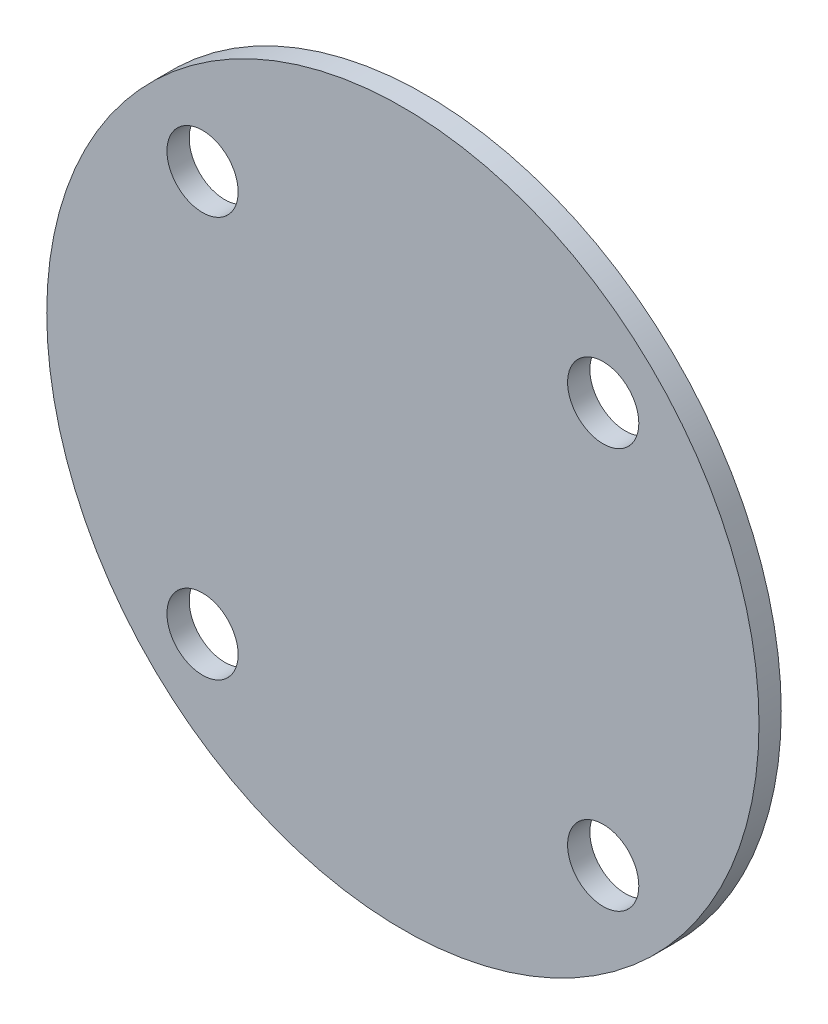
ISO-10303-21;
HEADER;
FILE_DESCRIPTION(('STEP AP214'),'2;1');
FILE_NAME('part.step','',(''),(''),'','','');
FILE_SCHEMA(('AUTOMOTIVE_DESIGN { 1 0 10303 214 1 1 1 1 }'));
ENDSEC;
DATA;
#1=APPLICATION_CONTEXT('core data for automotive mechanical design processes');
#2=APPLICATION_PROTOCOL_DEFINITION('international standard','automotive_design',2000,#1);
#3=PRODUCT_CONTEXT('',#1,'mechanical');
#4=PRODUCT('Part','Part','',(#3));
#5=PRODUCT_RELATED_PRODUCT_CATEGORY('part','',(#4));
#6=PRODUCT_DEFINITION_FORMATION('','',#4);
#7=PRODUCT_DEFINITION_CONTEXT('part definition',#1,'design');
#8=PRODUCT_DEFINITION('design','',#6,#7);
#9=PRODUCT_DEFINITION_SHAPE('','',#8);
#10=(LENGTH_UNIT() NAMED_UNIT(*) SI_UNIT(.MILLI.,.METRE.));
#11=(NAMED_UNIT(*) PLANE_ANGLE_UNIT() SI_UNIT($,.RADIAN.));
#12=(NAMED_UNIT(*) SI_UNIT($,.STERADIAN.) SOLID_ANGLE_UNIT());
#13=UNCERTAINTY_MEASURE_WITH_UNIT(LENGTH_MEASURE(1.E-05),#10,'distance_accuracy_value','');
#14=(GEOMETRIC_REPRESENTATION_CONTEXT(3) GLOBAL_UNCERTAINTY_ASSIGNED_CONTEXT((#13)) GLOBAL_UNIT_ASSIGNED_CONTEXT((#10,
#11,#12)) REPRESENTATION_CONTEXT('',''));
#15=CARTESIAN_POINT('',(0.,0.,0.));
#16=DIRECTION('',(0.,0.,1.));
#17=DIRECTION('',(1.,0.,0.));
#18=AXIS2_PLACEMENT_3D('',#15,#16,#17);
#19=CARTESIAN_POINT('',(0.,0.,-1.));
#20=DIRECTION('',(0.,0.,1.));
#21=DIRECTION('',(-1.,0.,0.));
#22=AXIS2_PLACEMENT_3D('',#19,#20,#21);
#23=CYLINDRICAL_SURFACE('',#22,16.);
#24=CARTESIAN_POINT('',(0.,0.,-1.));
#25=DIRECTION('',(0.,0.,1.));
#26=DIRECTION('',(1.,0.,0.));
#27=AXIS2_PLACEMENT_3D('',#24,#25,#26);
#28=CIRCLE('',#27,16.);
#29=CARTESIAN_POINT('',(16.,0.,-1.));
#30=VERTEX_POINT('',#29);
#31=EDGE_CURVE('E10',#30,#30,#28,.T.);
#32=ORIENTED_EDGE('',*,*,#31,.T.);
#33=EDGE_LOOP('',(#32));
#34=FACE_BOUND('',#33,.T.);
#35=CARTESIAN_POINT('',(0.,0.,0.));
#36=DIRECTION('',(0.,0.,1.));
#37=DIRECTION('',(1.,0.,0.));
#38=AXIS2_PLACEMENT_3D('',#35,#36,#37);
#39=CIRCLE('',#38,16.);
#40=CARTESIAN_POINT('',(16.,0.,0.));
#41=VERTEX_POINT('',#40);
#42=EDGE_CURVE('E44',#41,#41,#39,.T.);
#43=ORIENTED_EDGE('',*,*,#42,.F.);
#44=EDGE_LOOP('',(#43));
#45=FACE_BOUND('',#44,.T.);
#46=ADVANCED_FACE('F41',(#34,#45),#23,.T.);
#47=CARTESIAN_POINT('',(0.,0.,-1.));
#48=DIRECTION('',(0.,0.,-1.));
#49=DIRECTION('',(1.,0.,0.));
#50=AXIS2_PLACEMENT_3D('',#47,#48,#49);
#51=PLANE('',#50);
#52=CARTESIAN_POINT('',(-9.,9.,-1.));
#53=DIRECTION('',(0.,0.,1.));
#54=DIRECTION('',(1.,0.,0.));
#55=AXIS2_PLACEMENT_3D('',#52,#53,#54);
#56=CIRCLE('',#55,1.6);
#57=CARTESIAN_POINT('',(-7.4,9.,-1.));
#58=VERTEX_POINT('',#57);
#59=EDGE_CURVE('E59',#58,#58,#56,.T.);
#60=ORIENTED_EDGE('',*,*,#59,.T.);
#61=EDGE_LOOP('',(#60));
#62=FACE_BOUND('',#61,.T.);
#63=CARTESIAN_POINT('',(-9.,-9.,-1.));
#64=DIRECTION('',(0.,0.,1.));
#65=DIRECTION('',(1.,0.,0.));
#66=AXIS2_PLACEMENT_3D('',#63,#64,#65);
#67=CIRCLE('',#66,1.6);
#68=CARTESIAN_POINT('',(-7.4,-9.,-1.));
#69=VERTEX_POINT('',#68);
#70=EDGE_CURVE('E65',#69,#69,#67,.T.);
#71=ORIENTED_EDGE('',*,*,#70,.T.);
#72=EDGE_LOOP('',(#71));
#73=FACE_BOUND('',#72,.T.);
#74=CARTESIAN_POINT('',(9.,-9.,-1.));
#75=DIRECTION('',(0.,0.,1.));
#76=DIRECTION('',(1.,0.,0.));
#77=AXIS2_PLACEMENT_3D('',#74,#75,#76);
#78=CIRCLE('',#77,1.6);
#79=CARTESIAN_POINT('',(10.6,-9.,-1.));
#80=VERTEX_POINT('',#79);
#81=EDGE_CURVE('E71',#80,#80,#78,.T.);
#82=ORIENTED_EDGE('',*,*,#81,.T.);
#83=EDGE_LOOP('',(#82));
#84=FACE_BOUND('',#83,.T.);
#85=CARTESIAN_POINT('',(9.,9.,-1.));
#86=DIRECTION('',(0.,0.,1.));
#87=DIRECTION('',(1.,0.,0.));
#88=AXIS2_PLACEMENT_3D('',#85,#86,#87);
#89=CIRCLE('',#88,1.6);
#90=CARTESIAN_POINT('',(10.6,9.,-1.));
#91=VERTEX_POINT('',#90);
#92=EDGE_CURVE('E51',#91,#91,#89,.T.);
#93=ORIENTED_EDGE('',*,*,#92,.T.);
#94=EDGE_LOOP('',(#93));
#95=FACE_BOUND('',#94,.T.);
#96=ORIENTED_EDGE('',*,*,#31,.F.);
#97=EDGE_LOOP('',(#96));
#98=FACE_BOUND('',#97,.T.);
#99=ADVANCED_FACE('F83',(#62,#73,#84,#95,#98),#51,.T.);
#100=CARTESIAN_POINT('',(0.,0.,0.));
#101=DIRECTION('',(0.,0.,-1.));
#102=DIRECTION('',(1.,0.,0.));
#103=AXIS2_PLACEMENT_3D('',#100,#101,#102);
#104=PLANE('',#103);
#105=CARTESIAN_POINT('',(-9.,9.,0.));
#106=DIRECTION('',(0.,0.,1.));
#107=DIRECTION('',(1.,0.,0.));
#108=AXIS2_PLACEMENT_3D('',#105,#106,#107);
#109=CIRCLE('',#108,1.6);
#110=CARTESIAN_POINT('',(-7.4,9.,0.));
#111=VERTEX_POINT('',#110);
#112=EDGE_CURVE('E62',#111,#111,#109,.T.);
#113=ORIENTED_EDGE('',*,*,#112,.F.);
#114=EDGE_LOOP('',(#113));
#115=FACE_BOUND('',#114,.T.);
#116=CARTESIAN_POINT('',(-9.,-9.,0.));
#117=DIRECTION('',(0.,0.,1.));
#118=DIRECTION('',(1.,0.,0.));
#119=AXIS2_PLACEMENT_3D('',#116,#117,#118);
#120=CIRCLE('',#119,1.6);
#121=CARTESIAN_POINT('',(-7.4,-9.,0.));
#122=VERTEX_POINT('',#121);
#123=EDGE_CURVE('E68',#122,#122,#120,.T.);
#124=ORIENTED_EDGE('',*,*,#123,.F.);
#125=EDGE_LOOP('',(#124));
#126=FACE_BOUND('',#125,.T.);
#127=CARTESIAN_POINT('',(9.,-9.,0.));
#128=DIRECTION('',(0.,0.,1.));
#129=DIRECTION('',(1.,0.,0.));
#130=AXIS2_PLACEMENT_3D('',#127,#128,#129);
#131=CIRCLE('',#130,1.6);
#132=CARTESIAN_POINT('',(10.6,-9.,0.));
#133=VERTEX_POINT('',#132);
#134=EDGE_CURVE('E56',#133,#133,#131,.T.);
#135=ORIENTED_EDGE('',*,*,#134,.F.);
#136=EDGE_LOOP('',(#135));
#137=FACE_BOUND('',#136,.T.);
#138=CARTESIAN_POINT('',(9.,9.,0.));
#139=DIRECTION('',(0.,0.,1.));
#140=DIRECTION('',(1.,0.,0.));
#141=AXIS2_PLACEMENT_3D('',#138,#139,#140);
#142=CIRCLE('',#141,1.6);
#143=CARTESIAN_POINT('',(10.6,9.,0.));
#144=VERTEX_POINT('',#143);
#145=EDGE_CURVE('E53',#144,#144,#142,.T.);
#146=ORIENTED_EDGE('',*,*,#145,.F.);
#147=EDGE_LOOP('',(#146));
#148=FACE_BOUND('',#147,.T.);
#149=ORIENTED_EDGE('',*,*,#42,.T.);
#150=EDGE_LOOP('',(#149));
#151=FACE_BOUND('',#150,.T.);
#152=ADVANCED_FACE('F79',(#115,#126,#137,#148,#151),#104,.F.);
#153=CARTESIAN_POINT('',(9.,9.,-1.));
#154=DIRECTION('',(0.,0.,1.));
#155=DIRECTION('',(-1.,0.,0.));
#156=AXIS2_PLACEMENT_3D('',#153,#154,#155);
#157=CYLINDRICAL_SURFACE('',#156,1.6);
#158=ORIENTED_EDGE('',*,*,#92,.F.);
#159=EDGE_LOOP('',(#158));
#160=FACE_BOUND('',#159,.T.);
#161=ORIENTED_EDGE('',*,*,#145,.T.);
#162=EDGE_LOOP('',(#161));
#163=FACE_BOUND('',#162,.T.);
#164=ADVANCED_FACE('F82',(#160,#163),#157,.F.);
#165=CARTESIAN_POINT('',(9.,-9.,-1.));
#166=DIRECTION('',(0.,0.,1.));
#167=DIRECTION('',(-1.,0.,0.));
#168=AXIS2_PLACEMENT_3D('',#165,#166,#167);
#169=CYLINDRICAL_SURFACE('',#168,1.6);
#170=ORIENTED_EDGE('',*,*,#81,.F.);
#171=EDGE_LOOP('',(#170));
#172=FACE_BOUND('',#171,.T.);
#173=ORIENTED_EDGE('',*,*,#134,.T.);
#174=EDGE_LOOP('',(#173));
#175=FACE_BOUND('',#174,.T.);
#176=ADVANCED_FACE('F77',(#172,#175),#169,.F.);
#177=CARTESIAN_POINT('',(-9.,-9.,-1.));
#178=DIRECTION('',(0.,0.,1.));
#179=DIRECTION('',(-1.,0.,0.));
#180=AXIS2_PLACEMENT_3D('',#177,#178,#179);
#181=CYLINDRICAL_SURFACE('',#180,1.6);
#182=ORIENTED_EDGE('',*,*,#70,.F.);
#183=EDGE_LOOP('',(#182));
#184=FACE_BOUND('',#183,.T.);
#185=ORIENTED_EDGE('',*,*,#123,.T.);
#186=EDGE_LOOP('',(#185));
#187=FACE_BOUND('',#186,.T.);
#188=ADVANCED_FACE('F105',(#184,#187),#181,.F.);
#189=CARTESIAN_POINT('',(-9.,9.,-1.));
#190=DIRECTION('',(0.,0.,1.));
#191=DIRECTION('',(-1.,0.,0.));
#192=AXIS2_PLACEMENT_3D('',#189,#190,#191);
#193=CYLINDRICAL_SURFACE('',#192,1.6);
#194=ORIENTED_EDGE('',*,*,#59,.F.);
#195=EDGE_LOOP('',(#194));
#196=FACE_BOUND('',#195,.T.);
#197=ORIENTED_EDGE('',*,*,#112,.T.);
#198=EDGE_LOOP('',(#197));
#199=FACE_BOUND('',#198,.T.);
#200=ADVANCED_FACE('F102',(#196,#199),#193,.F.);
#201=CLOSED_SHELL('',(#46,#99,#152,#164,#176,#188,#200));
#202=MANIFOLD_SOLID_BREP('B2',#201);
#203=ADVANCED_BREP_SHAPE_REPRESENTATION('',(#18,#202),#14);
#204=SHAPE_DEFINITION_REPRESENTATION(#9,#203);
ENDSEC;
END-ISO-10303-21;
